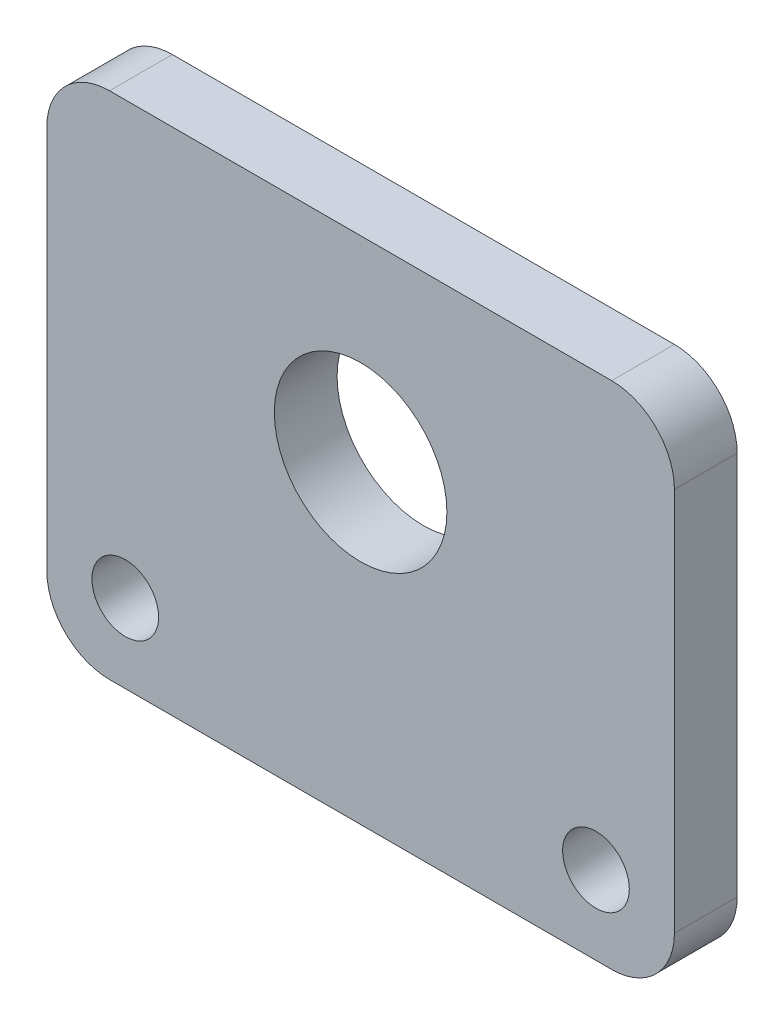
ISO-10303-21;
HEADER;
FILE_DESCRIPTION(('STEP AP214'),'2;1');
FILE_NAME('part.step','',(''),(''),'','','');
FILE_SCHEMA(('AUTOMOTIVE_DESIGN { 1 0 10303 214 1 1 1 1 }'));
ENDSEC;
DATA;
#1=APPLICATION_CONTEXT('core data for automotive mechanical design processes');
#2=APPLICATION_PROTOCOL_DEFINITION('international standard','automotive_design',2000,#1);
#3=PRODUCT_CONTEXT('',#1,'mechanical');
#4=PRODUCT('Part','Part','',(#3));
#5=PRODUCT_RELATED_PRODUCT_CATEGORY('part','',(#4));
#6=PRODUCT_DEFINITION_FORMATION('','',#4);
#7=PRODUCT_DEFINITION_CONTEXT('part definition',#1,'design');
#8=PRODUCT_DEFINITION('design','',#6,#7);
#9=PRODUCT_DEFINITION_SHAPE('','',#8);
#10=(LENGTH_UNIT() NAMED_UNIT(*) SI_UNIT(.MILLI.,.METRE.));
#11=(NAMED_UNIT(*) PLANE_ANGLE_UNIT() SI_UNIT($,.RADIAN.));
#12=(NAMED_UNIT(*) SI_UNIT($,.STERADIAN.) SOLID_ANGLE_UNIT());
#13=UNCERTAINTY_MEASURE_WITH_UNIT(LENGTH_MEASURE(1.E-05),#10,'distance_accuracy_value','');
#14=(GEOMETRIC_REPRESENTATION_CONTEXT(3) GLOBAL_UNCERTAINTY_ASSIGNED_CONTEXT((#13)) GLOBAL_UNIT_ASSIGNED_CONTEXT((#10,
#11,#12)) REPRESENTATION_CONTEXT('',''));
#15=CARTESIAN_POINT('',(0.,0.,0.));
#16=DIRECTION('',(0.,0.,1.));
#17=DIRECTION('',(1.,0.,0.));
#18=AXIS2_PLACEMENT_3D('',#15,#16,#17);
#19=CARTESIAN_POINT('',(-40.,-40.,4.));
#20=DIRECTION('',(0.,0.,1.));
#21=DIRECTION('',(1.,0.,0.));
#22=AXIS2_PLACEMENT_3D('',#19,#20,#21);
#23=PLANE('',#22);
#24=CARTESIAN_POINT('',(-30.,-30.,4.));
#25=DIRECTION('',(0.,0.,1.));
#26=DIRECTION('',(1.,0.,0.));
#27=AXIS2_PLACEMENT_3D('',#24,#25,#26);
#28=CIRCLE('',#27,4.25);
#29=CARTESIAN_POINT('',(-25.75,-30.,4.));
#30=VERTEX_POINT('',#29);
#31=EDGE_CURVE('E181',#30,#30,#28,.T.);
#32=ORIENTED_EDGE('',*,*,#31,.F.);
#33=EDGE_LOOP('',(#32));
#34=FACE_BOUND('',#33,.T.);
#35=DIRECTION('',(1.,0.,0.));
#36=VECTOR('',#35,1.);
#37=CARTESIAN_POINT('',(-40.,-40.,4.));
#38=LINE('',#37,#36);
#39=CARTESIAN_POINT('',(-32.,-40.,4.));
#40=VERTEX_POINT('',#39);
#41=CARTESIAN_POINT('',(32.,-40.,4.));
#42=VERTEX_POINT('',#41);
#43=EDGE_CURVE('E167',#40,#42,#38,.T.);
#44=ORIENTED_EDGE('',*,*,#43,.T.);
#45=CARTESIAN_POINT('',(32.,-32.,4.));
#46=DIRECTION('',(0.,0.,1.));
#47=DIRECTION('',(1.,0.,0.));
#48=AXIS2_PLACEMENT_3D('',#45,#46,#47);
#49=CIRCLE('',#48,8.);
#50=CARTESIAN_POINT('',(40.,-32.,4.));
#51=VERTEX_POINT('',#50);
#52=EDGE_CURVE('E145',#42,#51,#49,.T.);
#53=ORIENTED_EDGE('',*,*,#52,.T.);
#54=DIRECTION('',(0.,1.,0.));
#55=VECTOR('',#54,1.);
#56=CARTESIAN_POINT('',(40.,25.,4.));
#57=LINE('',#56,#55);
#58=CARTESIAN_POINT('',(40.,17.,4.));
#59=VERTEX_POINT('',#58);
#60=EDGE_CURVE('E115',#51,#59,#57,.T.);
#61=ORIENTED_EDGE('',*,*,#60,.T.);
#62=CARTESIAN_POINT('',(32.,17.,4.));
#63=DIRECTION('',(0.,0.,1.));
#64=DIRECTION('',(1.,0.,0.));
#65=AXIS2_PLACEMENT_3D('',#62,#63,#64);
#66=CIRCLE('',#65,8.);
#67=CARTESIAN_POINT('',(32.,25.,4.));
#68=VERTEX_POINT('',#67);
#69=EDGE_CURVE('E51',#59,#68,#66,.T.);
#70=ORIENTED_EDGE('',*,*,#69,.T.);
#71=DIRECTION('',(-1.,0.,0.));
#72=VECTOR('',#71,1.);
#73=CARTESIAN_POINT('',(-40.,25.,4.));
#74=LINE('',#73,#72);
#75=CARTESIAN_POINT('',(-32.,25.,4.));
#76=VERTEX_POINT('',#75);
#77=EDGE_CURVE('E131',#68,#76,#74,.T.);
#78=ORIENTED_EDGE('',*,*,#77,.T.);
#79=CARTESIAN_POINT('',(-32.,17.,4.));
#80=DIRECTION('',(0.,0.,1.));
#81=DIRECTION('',(1.,0.,0.));
#82=AXIS2_PLACEMENT_3D('',#79,#80,#81);
#83=CIRCLE('',#82,8.);
#84=CARTESIAN_POINT('',(-40.,17.,4.));
#85=VERTEX_POINT('',#84);
#86=EDGE_CURVE('E141',#76,#85,#83,.T.);
#87=ORIENTED_EDGE('',*,*,#86,.T.);
#88=DIRECTION('',(0.,-1.,0.));
#89=VECTOR('',#88,1.);
#90=CARTESIAN_POINT('',(-40.,25.,4.));
#91=LINE('',#90,#89);
#92=CARTESIAN_POINT('',(-40.,-32.,4.));
#93=VERTEX_POINT('',#92);
#94=EDGE_CURVE('E125',#85,#93,#91,.T.);
#95=ORIENTED_EDGE('',*,*,#94,.T.);
#96=CARTESIAN_POINT('',(-32.,-32.,4.));
#97=DIRECTION('',(0.,0.,1.));
#98=DIRECTION('',(1.,0.,0.));
#99=AXIS2_PLACEMENT_3D('',#96,#97,#98);
#100=CIRCLE('',#99,8.);
#101=EDGE_CURVE('E143',#93,#40,#100,.T.);
#102=ORIENTED_EDGE('',*,*,#101,.T.);
#103=EDGE_LOOP('',(#44,#53,#61,#70,#78,#87,#95,#102));
#104=FACE_BOUND('',#103,.T.);
#105=CARTESIAN_POINT('',(0.,0.,4.));
#106=DIRECTION('',(0.,0.,1.));
#107=DIRECTION('',(1.,0.,0.));
#108=AXIS2_PLACEMENT_3D('',#105,#106,#107);
#109=CIRCLE('',#108,11.);
#110=CARTESIAN_POINT('',(11.,0.,4.));
#111=VERTEX_POINT('',#110);
#112=EDGE_CURVE('E176',#111,#111,#109,.T.);
#113=ORIENTED_EDGE('',*,*,#112,.F.);
#114=EDGE_LOOP('',(#113));
#115=FACE_BOUND('',#114,.T.);
#116=CARTESIAN_POINT('',(30.,-30.,4.));
#117=DIRECTION('',(0.,0.,1.));
#118=DIRECTION('',(1.,0.,0.));
#119=AXIS2_PLACEMENT_3D('',#116,#117,#118);
#120=CIRCLE('',#119,4.25);
#121=CARTESIAN_POINT('',(34.25,-30.,4.));
#122=VERTEX_POINT('',#121);
#123=EDGE_CURVE('E186',#122,#122,#120,.T.);
#124=ORIENTED_EDGE('',*,*,#123,.F.);
#125=EDGE_LOOP('',(#124));
#126=FACE_BOUND('',#125,.T.);
#127=ADVANCED_FACE('F31',(#34,#104,#115,#126),#23,.T.);
#128=CARTESIAN_POINT('',(-40.,-40.,-4.));
#129=DIRECTION('',(0.,0.,1.));
#130=DIRECTION('',(1.,0.,0.));
#131=AXIS2_PLACEMENT_3D('',#128,#129,#130);
#132=PLANE('',#131);
#133=CARTESIAN_POINT('',(-30.,-30.,-4.));
#134=DIRECTION('',(0.,0.,1.));
#135=DIRECTION('',(1.,0.,0.));
#136=AXIS2_PLACEMENT_3D('',#133,#134,#135);
#137=CIRCLE('',#136,4.25);
#138=CARTESIAN_POINT('',(-25.75,-30.,-4.));
#139=VERTEX_POINT('',#138);
#140=EDGE_CURVE('E183',#139,#139,#137,.T.);
#141=ORIENTED_EDGE('',*,*,#140,.T.);
#142=EDGE_LOOP('',(#141));
#143=FACE_BOUND('',#142,.T.);
#144=DIRECTION('',(0.,1.,0.));
#145=VECTOR('',#144,1.);
#146=CARTESIAN_POINT('',(40.,25.,-4.));
#147=LINE('',#146,#145);
#148=CARTESIAN_POINT('',(40.,-32.,-4.));
#149=VERTEX_POINT('',#148);
#150=CARTESIAN_POINT('',(40.,17.,-4.));
#151=VERTEX_POINT('',#150);
#152=EDGE_CURVE('E113',#149,#151,#147,.T.);
#153=ORIENTED_EDGE('',*,*,#152,.F.);
#154=CARTESIAN_POINT('',(32.,-32.,-4.));
#155=DIRECTION('',(0.,0.,1.));
#156=DIRECTION('',(1.,0.,0.));
#157=AXIS2_PLACEMENT_3D('',#154,#155,#156);
#158=CIRCLE('',#157,8.);
#159=CARTESIAN_POINT('',(32.,-40.,-4.));
#160=VERTEX_POINT('',#159);
#161=EDGE_CURVE('E96',#149,#160,#158,.F.);
#162=ORIENTED_EDGE('',*,*,#161,.T.);
#163=DIRECTION('',(1.,0.,0.));
#164=VECTOR('',#163,1.);
#165=CARTESIAN_POINT('',(-40.,-40.,-4.));
#166=LINE('',#165,#164);
#167=CARTESIAN_POINT('',(-32.,-40.,-4.));
#168=VERTEX_POINT('',#167);
#169=EDGE_CURVE('E123',#168,#160,#166,.T.);
#170=ORIENTED_EDGE('',*,*,#169,.F.);
#171=CARTESIAN_POINT('',(-32.,-32.,-4.));
#172=DIRECTION('',(0.,0.,1.));
#173=DIRECTION('',(1.,0.,0.));
#174=AXIS2_PLACEMENT_3D('',#171,#172,#173);
#175=CIRCLE('',#174,8.);
#176=CARTESIAN_POINT('',(-40.,-32.,-4.));
#177=VERTEX_POINT('',#176);
#178=EDGE_CURVE('E107',#168,#177,#175,.F.);
#179=ORIENTED_EDGE('',*,*,#178,.T.);
#180=DIRECTION('',(0.,-1.,0.));
#181=VECTOR('',#180,1.);
#182=CARTESIAN_POINT('',(-40.,25.,-4.));
#183=LINE('',#182,#181);
#184=CARTESIAN_POINT('',(-40.,17.,-4.));
#185=VERTEX_POINT('',#184);
#186=EDGE_CURVE('E127',#185,#177,#183,.T.);
#187=ORIENTED_EDGE('',*,*,#186,.F.);
#188=CARTESIAN_POINT('',(-32.,17.,-4.));
#189=DIRECTION('',(0.,0.,1.));
#190=DIRECTION('',(1.,0.,0.));
#191=AXIS2_PLACEMENT_3D('',#188,#189,#190);
#192=CIRCLE('',#191,8.);
#193=CARTESIAN_POINT('',(-32.,25.,-4.));
#194=VERTEX_POINT('',#193);
#195=EDGE_CURVE('E134',#185,#194,#192,.F.);
#196=ORIENTED_EDGE('',*,*,#195,.T.);
#197=DIRECTION('',(-1.,0.,0.));
#198=VECTOR('',#197,1.);
#199=CARTESIAN_POINT('',(-40.,25.,-4.));
#200=LINE('',#199,#198);
#201=CARTESIAN_POINT('',(32.,25.,-4.));
#202=VERTEX_POINT('',#201);
#203=EDGE_CURVE('E122',#202,#194,#200,.T.);
#204=ORIENTED_EDGE('',*,*,#203,.F.);
#205=CARTESIAN_POINT('',(32.,17.,-4.));
#206=DIRECTION('',(0.,0.,1.));
#207=DIRECTION('',(1.,0.,0.));
#208=AXIS2_PLACEMENT_3D('',#205,#206,#207);
#209=CIRCLE('',#208,8.);
#210=EDGE_CURVE('E116',#202,#151,#209,.F.);
#211=ORIENTED_EDGE('',*,*,#210,.T.);
#212=EDGE_LOOP('',(#153,#162,#170,#179,#187,#196,#204,#211));
#213=FACE_BOUND('',#212,.T.);
#214=CARTESIAN_POINT('',(0.,0.,-4.));
#215=DIRECTION('',(0.,0.,1.));
#216=DIRECTION('',(1.,0.,0.));
#217=AXIS2_PLACEMENT_3D('',#214,#215,#216);
#218=CIRCLE('',#217,11.);
#219=CARTESIAN_POINT('',(11.,0.,-4.));
#220=VERTEX_POINT('',#219);
#221=EDGE_CURVE('E172',#220,#220,#218,.T.);
#222=ORIENTED_EDGE('',*,*,#221,.T.);
#223=EDGE_LOOP('',(#222));
#224=FACE_BOUND('',#223,.T.);
#225=CARTESIAN_POINT('',(30.,-30.,-4.));
#226=DIRECTION('',(0.,0.,1.));
#227=DIRECTION('',(1.,0.,0.));
#228=AXIS2_PLACEMENT_3D('',#225,#226,#227);
#229=CIRCLE('',#228,4.25);
#230=CARTESIAN_POINT('',(34.25,-30.,-4.));
#231=VERTEX_POINT('',#230);
#232=EDGE_CURVE('E189',#231,#231,#229,.T.);
#233=ORIENTED_EDGE('',*,*,#232,.T.);
#234=EDGE_LOOP('',(#233));
#235=FACE_BOUND('',#234,.T.);
#236=ADVANCED_FACE('F119',(#143,#213,#224,#235),#132,.F.);
#237=CARTESIAN_POINT('',(-40.,25.,4.));
#238=DIRECTION('',(1.,0.,0.));
#239=DIRECTION('',(0.,1.,0.));
#240=AXIS2_PLACEMENT_3D('',#237,#238,#239);
#241=PLANE('',#240);
#242=ORIENTED_EDGE('',*,*,#186,.T.);
#243=DIRECTION('',(0.,0.,-1.));
#244=VECTOR('',#243,1.);
#245=CARTESIAN_POINT('',(-40.,-32.,4.));
#246=LINE('',#245,#244);
#247=EDGE_CURVE('E150',#177,#93,#246,.F.);
#248=ORIENTED_EDGE('',*,*,#247,.T.);
#249=ORIENTED_EDGE('',*,*,#94,.F.);
#250=DIRECTION('',(0.,0.,-1.));
#251=VECTOR('',#250,1.);
#252=CARTESIAN_POINT('',(-40.,17.,4.));
#253=LINE('',#252,#251);
#254=EDGE_CURVE('E147',#85,#185,#253,.T.);
#255=ORIENTED_EDGE('',*,*,#254,.T.);
#256=EDGE_LOOP('',(#242,#248,#249,#255));
#257=FACE_BOUND('',#256,.T.);
#258=ADVANCED_FACE('F163',(#257),#241,.F.);
#259=CARTESIAN_POINT('',(-40.,-40.,4.));
#260=DIRECTION('',(0.,1.,0.));
#261=DIRECTION('',(0.,0.,1.));
#262=AXIS2_PLACEMENT_3D('',#259,#260,#261);
#263=PLANE('',#262);
#264=ORIENTED_EDGE('',*,*,#169,.T.);
#265=DIRECTION('',(0.,0.,-1.));
#266=VECTOR('',#265,1.);
#267=CARTESIAN_POINT('',(32.,-40.,4.));
#268=LINE('',#267,#266);
#269=EDGE_CURVE('E101',#160,#42,#268,.F.);
#270=ORIENTED_EDGE('',*,*,#269,.T.);
#271=ORIENTED_EDGE('',*,*,#43,.F.);
#272=DIRECTION('',(0.,0.,-1.));
#273=VECTOR('',#272,1.);
#274=CARTESIAN_POINT('',(-32.,-40.,4.));
#275=LINE('',#274,#273);
#276=EDGE_CURVE('E106',#40,#168,#275,.T.);
#277=ORIENTED_EDGE('',*,*,#276,.T.);
#278=EDGE_LOOP('',(#264,#270,#271,#277));
#279=FACE_BOUND('',#278,.T.);
#280=ADVANCED_FACE('F215',(#279),#263,.F.);
#281=CARTESIAN_POINT('',(40.,25.,4.));
#282=DIRECTION('',(-1.,0.,0.));
#283=DIRECTION('',(0.,-1.,0.));
#284=AXIS2_PLACEMENT_3D('',#281,#282,#283);
#285=PLANE('',#284);
#286=ORIENTED_EDGE('',*,*,#60,.F.);
#287=DIRECTION('',(0.,0.,-1.));
#288=VECTOR('',#287,1.);
#289=CARTESIAN_POINT('',(40.,-32.,4.));
#290=LINE('',#289,#288);
#291=EDGE_CURVE('E100',#51,#149,#290,.T.);
#292=ORIENTED_EDGE('',*,*,#291,.T.);
#293=ORIENTED_EDGE('',*,*,#152,.T.);
#294=DIRECTION('',(0.,0.,-1.));
#295=VECTOR('',#294,1.);
#296=CARTESIAN_POINT('',(40.,17.,4.));
#297=LINE('',#296,#295);
#298=EDGE_CURVE('E117',#151,#59,#297,.F.);
#299=ORIENTED_EDGE('',*,*,#298,.T.);
#300=EDGE_LOOP('',(#286,#292,#293,#299));
#301=FACE_BOUND('',#300,.T.);
#302=ADVANCED_FACE('F112',(#301),#285,.F.);
#303=CARTESIAN_POINT('',(-40.,25.,4.));
#304=DIRECTION('',(0.,-1.,0.));
#305=DIRECTION('',(0.,0.,-1.));
#306=AXIS2_PLACEMENT_3D('',#303,#304,#305);
#307=PLANE('',#306);
#308=ORIENTED_EDGE('',*,*,#203,.T.);
#309=DIRECTION('',(0.,0.,-1.));
#310=VECTOR('',#309,1.);
#311=CARTESIAN_POINT('',(-32.,25.,4.));
#312=LINE('',#311,#310);
#313=EDGE_CURVE('E11',#194,#76,#312,.F.);
#314=ORIENTED_EDGE('',*,*,#313,.T.);
#315=ORIENTED_EDGE('',*,*,#77,.F.);
#316=DIRECTION('',(0.,0.,-1.));
#317=VECTOR('',#316,1.);
#318=CARTESIAN_POINT('',(32.,25.,4.));
#319=LINE('',#318,#317);
#320=EDGE_CURVE('E39',#68,#202,#319,.T.);
#321=ORIENTED_EDGE('',*,*,#320,.T.);
#322=EDGE_LOOP('',(#308,#314,#315,#321));
#323=FACE_BOUND('',#322,.T.);
#324=ADVANCED_FACE('F153',(#323),#307,.F.);
#325=CARTESIAN_POINT('',(0.,0.,4.));
#326=DIRECTION('',(0.,0.,-1.));
#327=DIRECTION('',(-1.,0.,0.));
#328=AXIS2_PLACEMENT_3D('',#325,#326,#327);
#329=CYLINDRICAL_SURFACE('',#328,11.);
#330=ORIENTED_EDGE('',*,*,#112,.T.);
#331=EDGE_LOOP('',(#330));
#332=FACE_BOUND('',#331,.T.);
#333=ORIENTED_EDGE('',*,*,#221,.F.);
#334=EDGE_LOOP('',(#333));
#335=FACE_BOUND('',#334,.T.);
#336=ADVANCED_FACE('F208',(#332,#335),#329,.F.);
#337=CARTESIAN_POINT('',(-30.,-30.,4.));
#338=DIRECTION('',(0.,0.,-1.));
#339=DIRECTION('',(-1.,0.,0.));
#340=AXIS2_PLACEMENT_3D('',#337,#338,#339);
#341=CYLINDRICAL_SURFACE('',#340,4.25);
#342=ORIENTED_EDGE('',*,*,#31,.T.);
#343=EDGE_LOOP('',(#342));
#344=FACE_BOUND('',#343,.T.);
#345=ORIENTED_EDGE('',*,*,#140,.F.);
#346=EDGE_LOOP('',(#345));
#347=FACE_BOUND('',#346,.T.);
#348=ADVANCED_FACE('F296',(#344,#347),#341,.F.);
#349=CARTESIAN_POINT('',(30.,-30.,4.));
#350=DIRECTION('',(0.,0.,-1.));
#351=DIRECTION('',(-1.,0.,0.));
#352=AXIS2_PLACEMENT_3D('',#349,#350,#351);
#353=CYLINDRICAL_SURFACE('',#352,4.25);
#354=ORIENTED_EDGE('',*,*,#123,.T.);
#355=EDGE_LOOP('',(#354));
#356=FACE_BOUND('',#355,.T.);
#357=ORIENTED_EDGE('',*,*,#232,.F.);
#358=EDGE_LOOP('',(#357));
#359=FACE_BOUND('',#358,.T.);
#360=ADVANCED_FACE('F195',(#356,#359),#353,.F.);
#361=CARTESIAN_POINT('',(32.,-32.,4.));
#362=DIRECTION('',(0.,0.,-1.));
#363=DIRECTION('',(-1.,0.,0.));
#364=AXIS2_PLACEMENT_3D('',#361,#362,#363);
#365=CYLINDRICAL_SURFACE('',#364,8.);
#366=ORIENTED_EDGE('',*,*,#52,.F.);
#367=ORIENTED_EDGE('',*,*,#269,.F.);
#368=ORIENTED_EDGE('',*,*,#161,.F.);
#369=ORIENTED_EDGE('',*,*,#291,.F.);
#370=EDGE_LOOP('',(#366,#367,#368,#369));
#371=FACE_BOUND('',#370,.T.);
#372=ADVANCED_FACE('F99',(#371),#365,.T.);
#373=CARTESIAN_POINT('',(-32.,-32.,4.));
#374=DIRECTION('',(0.,0.,-1.));
#375=DIRECTION('',(-1.,0.,0.));
#376=AXIS2_PLACEMENT_3D('',#373,#374,#375);
#377=CYLINDRICAL_SURFACE('',#376,8.);
#378=ORIENTED_EDGE('',*,*,#101,.F.);
#379=ORIENTED_EDGE('',*,*,#247,.F.);
#380=ORIENTED_EDGE('',*,*,#178,.F.);
#381=ORIENTED_EDGE('',*,*,#276,.F.);
#382=EDGE_LOOP('',(#378,#379,#380,#381));
#383=FACE_BOUND('',#382,.T.);
#384=ADVANCED_FACE('F223',(#383),#377,.T.);
#385=CARTESIAN_POINT('',(-32.,17.,4.));
#386=DIRECTION('',(0.,0.,-1.));
#387=DIRECTION('',(-1.,0.,0.));
#388=AXIS2_PLACEMENT_3D('',#385,#386,#387);
#389=CYLINDRICAL_SURFACE('',#388,8.);
#390=ORIENTED_EDGE('',*,*,#86,.F.);
#391=ORIENTED_EDGE('',*,*,#313,.F.);
#392=ORIENTED_EDGE('',*,*,#195,.F.);
#393=ORIENTED_EDGE('',*,*,#254,.F.);
#394=EDGE_LOOP('',(#390,#391,#392,#393));
#395=FACE_BOUND('',#394,.T.);
#396=ADVANCED_FACE('F160',(#395),#389,.T.);
#397=CARTESIAN_POINT('',(32.,17.,4.));
#398=DIRECTION('',(0.,0.,-1.));
#399=DIRECTION('',(-1.,0.,0.));
#400=AXIS2_PLACEMENT_3D('',#397,#398,#399);
#401=CYLINDRICAL_SURFACE('',#400,8.);
#402=ORIENTED_EDGE('',*,*,#69,.F.);
#403=ORIENTED_EDGE('',*,*,#298,.F.);
#404=ORIENTED_EDGE('',*,*,#210,.F.);
#405=ORIENTED_EDGE('',*,*,#320,.F.);
#406=EDGE_LOOP('',(#402,#403,#404,#405));
#407=FACE_BOUND('',#406,.T.);
#408=ADVANCED_FACE('F33',(#407),#401,.T.);
#409=CLOSED_SHELL('',(#127,#236,#258,#280,#302,#324,#336,#348,#360,#372,#384,#396,#408));
#410=MANIFOLD_SOLID_BREP('B2',#409);
#411=ADVANCED_BREP_SHAPE_REPRESENTATION('',(#18,#410),#14);
#412=SHAPE_DEFINITION_REPRESENTATION(#9,#411);
ENDSEC;
END-ISO-10303-21;
